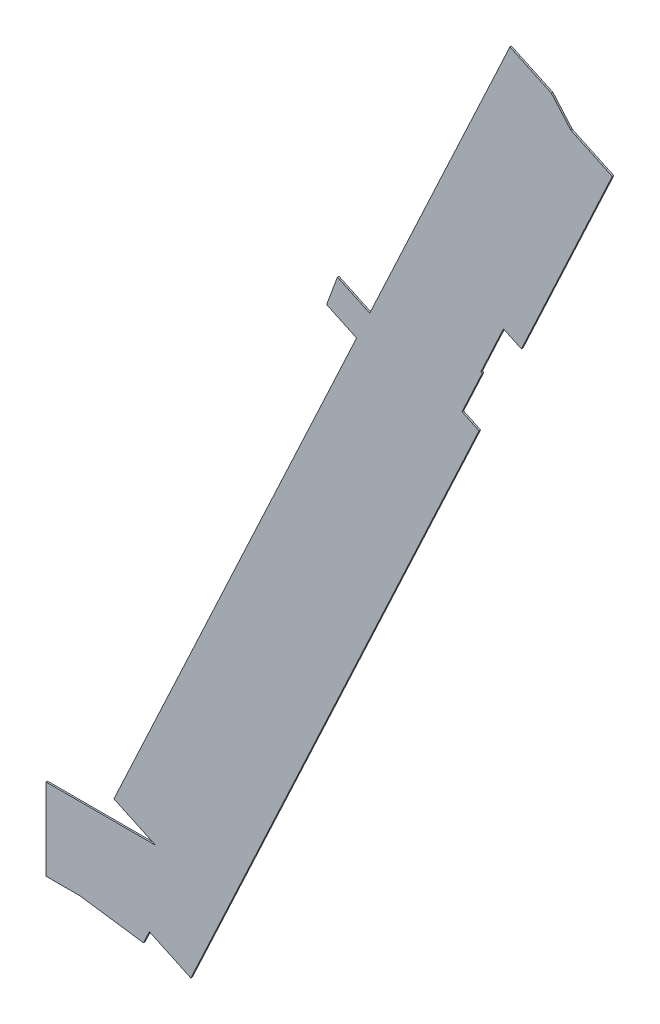
ISO-10303-21;
HEADER;
FILE_DESCRIPTION(('STEP AP214'),'2;1');
FILE_NAME('part.step','',(''),(''),'','','');
FILE_SCHEMA(('AUTOMOTIVE_DESIGN { 1 0 10303 214 1 1 1 1 }'));
ENDSEC;
DATA;
#1=APPLICATION_CONTEXT('core data for automotive mechanical design processes');
#2=APPLICATION_PROTOCOL_DEFINITION('international standard','automotive_design',2000,#1);
#3=PRODUCT_CONTEXT('',#1,'mechanical');
#4=PRODUCT('Part','Part','',(#3));
#5=PRODUCT_RELATED_PRODUCT_CATEGORY('part','',(#4));
#6=PRODUCT_DEFINITION_FORMATION('','',#4);
#7=PRODUCT_DEFINITION_CONTEXT('part definition',#1,'design');
#8=PRODUCT_DEFINITION('design','',#6,#7);
#9=PRODUCT_DEFINITION_SHAPE('','',#8);
#10=(LENGTH_UNIT() NAMED_UNIT(*) SI_UNIT(.MILLI.,.METRE.));
#11=(NAMED_UNIT(*) PLANE_ANGLE_UNIT() SI_UNIT($,.RADIAN.));
#12=(NAMED_UNIT(*) SI_UNIT($,.STERADIAN.) SOLID_ANGLE_UNIT());
#13=UNCERTAINTY_MEASURE_WITH_UNIT(LENGTH_MEASURE(1.E-05),#10,'distance_accuracy_value','');
#14=(GEOMETRIC_REPRESENTATION_CONTEXT(3) GLOBAL_UNCERTAINTY_ASSIGNED_CONTEXT((#13)) GLOBAL_UNIT_ASSIGNED_CONTEXT((#10,
#11,#12)) REPRESENTATION_CONTEXT('',''));
#15=CARTESIAN_POINT('',(0.,0.,0.));
#16=DIRECTION('',(0.,0.,1.));
#17=DIRECTION('',(1.,0.,0.));
#18=AXIS2_PLACEMENT_3D('',#15,#16,#17);
#19=CARTESIAN_POINT('',(-250.049303620003,-536.232462082202,48.5));
#20=DIRECTION('',(-0.42261826174037,-0.906307787036804,0.));
#21=DIRECTION('',(0.906307787036804,-0.42261826174037,0.));
#22=AXIS2_PLACEMENT_3D('',#19,#20,#21);
#23=PLANE('',#22);
#24=DIRECTION('',(0.906307787036804,-0.42261826174037,0.));
#25=VECTOR('',#24,1.);
#26=CARTESIAN_POINT('',(-250.049303620003,-536.232462082202,49.5));
#27=LINE('',#26,#25);
#28=CARTESIAN_POINT('',(1113.84582618202,-1172.22720602859,49.5));
#29=VERTEX_POINT('',#28);
#30=CARTESIAN_POINT('',(1141.03505979313,-1184.9057538808,49.5));
#31=VERTEX_POINT('',#30);
#32=EDGE_CURVE('E211',#29,#31,#27,.T.);
#33=ORIENTED_EDGE('',*,*,#32,.F.);
#34=DIRECTION('',(0.,0.,1.));
#35=VECTOR('',#34,1.);
#36=CARTESIAN_POINT('',(1113.84582618202,-1172.22720602859,48.5));
#37=LINE('',#36,#35);
#38=CARTESIAN_POINT('',(1113.84582618202,-1172.22720602859,48.5));
#39=VERTEX_POINT('',#38);
#40=EDGE_CURVE('E11',#39,#29,#37,.T.);
#41=ORIENTED_EDGE('',*,*,#40,.F.);
#42=DIRECTION('',(0.906307787036804,-0.42261826174037,0.));
#43=VECTOR('',#42,1.);
#44=CARTESIAN_POINT('',(-250.049303620003,-536.232462082202,48.5));
#45=LINE('',#44,#43);
#46=CARTESIAN_POINT('',(1141.03505979313,-1184.9057538808,48.5));
#47=VERTEX_POINT('',#46);
#48=EDGE_CURVE('E271',#39,#47,#45,.T.);
#49=ORIENTED_EDGE('',*,*,#48,.T.);
#50=DIRECTION('',(0.,0.,1.));
#51=VECTOR('',#50,1.);
#52=CARTESIAN_POINT('',(1141.03505979313,-1184.9057538808,48.5));
#53=LINE('',#52,#51);
#54=EDGE_CURVE('E38',#47,#31,#53,.T.);
#55=ORIENTED_EDGE('',*,*,#54,.T.);
#56=EDGE_LOOP('',(#33,#41,#49,#55));
#57=FACE_BOUND('',#56,.T.);
#58=ADVANCED_FACE('F35',(#57),#23,.T.);
#59=CARTESIAN_POINT('',(1363.89512980202,-635.994743946451,48.5));
#60=DIRECTION('',(0.906307787036787,-0.422618261740406,0.));
#61=DIRECTION('',(0.422618261740406,0.906307787036787,0.));
#62=AXIS2_PLACEMENT_3D('',#59,#60,#61);
#63=PLANE('',#62);
#64=DIRECTION('',(0.422618261740406,0.906307787036787,0.));
#65=VECTOR('',#64,1.);
#66=CARTESIAN_POINT('',(1363.89512980202,-635.994743946451,49.5));
#67=LINE('',#66,#65);
#68=CARTESIAN_POINT('',(1110.00000000019,-1180.47460689062,49.5));
#69=VERTEX_POINT('',#68);
#70=EDGE_CURVE('E269',#69,#29,#67,.T.);
#71=ORIENTED_EDGE('',*,*,#70,.F.);
#72=DIRECTION('',(0.,0.,1.));
#73=VECTOR('',#72,1.);
#74=CARTESIAN_POINT('',(1110.00000000019,-1180.47460689062,48.5));
#75=LINE('',#74,#73);
#76=CARTESIAN_POINT('',(1110.00000000019,-1180.47460689062,48.5));
#77=VERTEX_POINT('',#76);
#78=EDGE_CURVE('E44',#77,#69,#75,.T.);
#79=ORIENTED_EDGE('',*,*,#78,.F.);
#80=DIRECTION('',(0.422618261740406,0.906307787036787,0.));
#81=VECTOR('',#80,1.);
#82=CARTESIAN_POINT('',(1363.89512980202,-635.994743946451,48.5));
#83=LINE('',#82,#81);
#84=EDGE_CURVE('E201',#77,#39,#83,.T.);
#85=ORIENTED_EDGE('',*,*,#84,.T.);
#86=ORIENTED_EDGE('',*,*,#40,.T.);
#87=EDGE_LOOP('',(#71,#79,#85,#86));
#88=FACE_BOUND('',#87,.T.);
#89=ADVANCED_FACE('F313',(#88),#63,.T.);
#90=CARTESIAN_POINT('',(-141.191690871491,-1004.63108228358,48.5));
#91=DIRECTION('',(-0.139173100959475,-0.990268068741653,0.));
#92=DIRECTION('',(0.990268068741653,-0.139173100959475,0.));
#93=AXIS2_PLACEMENT_3D('',#90,#91,#92);
#94=PLANE('',#93);
#95=DIRECTION('',(0.990268068741653,-0.139173100959475,0.));
#96=VECTOR('',#95,1.);
#97=CARTESIAN_POINT('',(-141.191690871491,-1004.63108228358,49.5));
#98=LINE('',#97,#96);
#99=CARTESIAN_POINT('',(1068.20000000018,-1174.60000000009,49.5));
#100=VERTEX_POINT('',#99);
#101=EDGE_CURVE('E187',#100,#69,#98,.T.);
#102=ORIENTED_EDGE('',*,*,#101,.F.);
#103=DIRECTION('',(0.,0.,1.));
#104=VECTOR('',#103,1.);
#105=CARTESIAN_POINT('',(1068.20000000018,-1174.60000000009,48.5));
#106=LINE('',#105,#104);
#107=CARTESIAN_POINT('',(1068.20000000018,-1174.60000000009,48.5));
#108=VERTEX_POINT('',#107);
#109=EDGE_CURVE('E182',#108,#100,#106,.T.);
#110=ORIENTED_EDGE('',*,*,#109,.F.);
#111=DIRECTION('',(0.990268068741653,-0.139173100959475,0.));
#112=VECTOR('',#111,1.);
#113=CARTESIAN_POINT('',(-141.191690871491,-1004.63108228358,48.5));
#114=LINE('',#113,#112);
#115=EDGE_CURVE('E185',#108,#77,#114,.T.);
#116=ORIENTED_EDGE('',*,*,#115,.T.);
#117=ORIENTED_EDGE('',*,*,#78,.T.);
#118=EDGE_LOOP('',(#102,#110,#116,#117));
#119=FACE_BOUND('',#118,.T.);
#120=ADVANCED_FACE('F184',(#119),#94,.T.);
#121=CARTESIAN_POINT('',(4.38641042680267E-10,-1174.60000000049,48.5));
#122=DIRECTION('',(3.73438653737515E-13,-1.,0.));
#123=DIRECTION('',(1.,3.73438653737515E-13,0.));
#124=AXIS2_PLACEMENT_3D('',#121,#122,#123);
#125=PLANE('',#124);
#126=DIRECTION('',(1.,3.73438653737515E-13,0.));
#127=VECTOR('',#126,1.);
#128=CARTESIAN_POINT('',(4.38641042680267E-10,-1174.60000000049,49.5));
#129=LINE('',#128,#127);
#130=CARTESIAN_POINT('',(1046.20000000018,-1174.6000000001,49.5));
#131=VERTEX_POINT('',#130);
#132=EDGE_CURVE('E266',#131,#100,#129,.T.);
#133=ORIENTED_EDGE('',*,*,#132,.F.);
#134=DIRECTION('',(0.,0.,1.));
#135=VECTOR('',#134,1.);
#136=CARTESIAN_POINT('',(1046.20000000018,-1174.6000000001,48.5));
#137=LINE('',#136,#135);
#138=CARTESIAN_POINT('',(1046.20000000018,-1174.6000000001,48.5));
#139=VERTEX_POINT('',#138);
#140=EDGE_CURVE('E192',#139,#131,#137,.T.);
#141=ORIENTED_EDGE('',*,*,#140,.F.);
#142=DIRECTION('',(1.,3.73438653737515E-13,0.));
#143=VECTOR('',#142,1.);
#144=CARTESIAN_POINT('',(4.38641042680267E-10,-1174.60000000049,48.5));
#145=LINE('',#144,#143);
#146=EDGE_CURVE('E199',#139,#108,#145,.T.);
#147=ORIENTED_EDGE('',*,*,#146,.T.);
#148=ORIENTED_EDGE('',*,*,#109,.T.);
#149=EDGE_LOOP('',(#133,#141,#147,#148));
#150=FACE_BOUND('',#149,.T.);
#151=ADVANCED_FACE('F203',(#150),#125,.T.);
#152=CARTESIAN_POINT('',(1046.19999999975,3.86448090557967E-10,48.5));
#153=DIRECTION('',(-1.,-3.69382613800479E-13,0.));
#154=DIRECTION('',(3.69382613800479E-13,-1.,0.));
#155=AXIS2_PLACEMENT_3D('',#152,#153,#154);
#156=PLANE('',#155);
#157=DIRECTION('',(3.69382613800479E-13,-1.,0.));
#158=VECTOR('',#157,1.);
#159=CARTESIAN_POINT('',(1046.19999999975,3.86448090557967E-10,49.5));
#160=LINE('',#159,#158);
#161=CARTESIAN_POINT('',(1046.20000000016,-1121.10000000009,49.5));
#162=VERTEX_POINT('',#161);
#163=EDGE_CURVE('E263',#162,#131,#160,.T.);
#164=ORIENTED_EDGE('',*,*,#163,.F.);
#165=DIRECTION('',(0.,0.,1.));
#166=VECTOR('',#165,1.);
#167=CARTESIAN_POINT('',(1046.20000000016,-1121.10000000009,48.5));
#168=LINE('',#167,#166);
#169=CARTESIAN_POINT('',(1046.20000000016,-1121.10000000009,48.5));
#170=VERTEX_POINT('',#169);
#171=EDGE_CURVE('E275',#170,#162,#168,.T.);
#172=ORIENTED_EDGE('',*,*,#171,.F.);
#173=DIRECTION('',(3.69382613800479E-13,-1.,0.));
#174=VECTOR('',#173,1.);
#175=CARTESIAN_POINT('',(1046.19999999975,3.86448090557967E-10,48.5));
#176=LINE('',#175,#174);
#177=EDGE_CURVE('E204',#170,#139,#176,.T.);
#178=ORIENTED_EDGE('',*,*,#177,.T.);
#179=ORIENTED_EDGE('',*,*,#140,.T.);
#180=EDGE_LOOP('',(#164,#172,#178,#179));
#181=FACE_BOUND('',#180,.T.);
#182=ADVANCED_FACE('F326',(#181),#156,.T.);
#183=CARTESIAN_POINT('',(3.36261932278332E-09,-1121.10000000322,48.5));
#184=DIRECTION('',(-2.9993928487857E-12,1.,0.));
#185=DIRECTION('',(-1.,-2.9993928487857E-12,0.));
#186=AXIS2_PLACEMENT_3D('',#183,#184,#185);
#187=PLANE('',#186);
#188=DIRECTION('',(-1.,-2.9993928487857E-12,0.));
#189=VECTOR('',#188,1.);
#190=CARTESIAN_POINT('',(3.36261932278332E-09,-1121.10000000322,49.5));
#191=LINE('',#190,#189);
#192=CARTESIAN_POINT('',(1117.80000000016,-1121.09999999987,49.5));
#193=VERTEX_POINT('',#192);
#194=EDGE_CURVE('E260',#193,#162,#191,.T.);
#195=ORIENTED_EDGE('',*,*,#194,.F.);
#196=DIRECTION('',(0.,0.,1.));
#197=VECTOR('',#196,1.);
#198=CARTESIAN_POINT('',(1117.80000000016,-1121.09999999987,48.5));
#199=LINE('',#198,#197);
#200=CARTESIAN_POINT('',(1117.80000000016,-1121.09999999987,48.5));
#201=VERTEX_POINT('',#200);
#202=EDGE_CURVE('E277',#201,#193,#199,.T.);
#203=ORIENTED_EDGE('',*,*,#202,.F.);
#204=DIRECTION('',(-1.,-2.9993928487857E-12,0.));
#205=VECTOR('',#204,1.);
#206=CARTESIAN_POINT('',(3.36261932278332E-09,-1121.10000000322,48.5));
#207=LINE('',#206,#205);
#208=EDGE_CURVE('E206',#201,#170,#207,.T.);
#209=ORIENTED_EDGE('',*,*,#208,.T.);
#210=ORIENTED_EDGE('',*,*,#171,.T.);
#211=EDGE_LOOP('',(#195,#203,#209,#210));
#212=FACE_BOUND('',#211,.T.);
#213=ADVANCED_FACE('F329',(#212),#187,.T.);
#214=CARTESIAN_POINT('',(-229.760207644477,-492.722355355133,48.5));
#215=DIRECTION('',(-0.422618261737995,-0.906307787037911,0.));
#216=DIRECTION('',(0.906307787037911,-0.422618261737995,0.));
#217=AXIS2_PLACEMENT_3D('',#214,#215,#216);
#218=PLANE('',#217);
#219=DIRECTION('',(0.906307787037911,-0.422618261737995,0.));
#220=VECTOR('',#219,1.);
#221=CARTESIAN_POINT('',(-229.760207644477,-492.722355355133,49.5));
#222=LINE('',#221,#220);
#223=CARTESIAN_POINT('',(1090.61076638903,-1108.42145214773,49.5));
#224=VERTEX_POINT('',#223);
#225=EDGE_CURVE('E257',#224,#193,#222,.T.);
#226=ORIENTED_EDGE('',*,*,#225,.F.);
#227=DIRECTION('',(0.,0.,1.));
#228=VECTOR('',#227,1.);
#229=CARTESIAN_POINT('',(1090.61076638903,-1108.42145214773,48.5));
#230=LINE('',#229,#228);
#231=CARTESIAN_POINT('',(1090.61076638903,-1108.42145214773,48.5));
#232=VERTEX_POINT('',#231);
#233=EDGE_CURVE('E279',#232,#224,#230,.T.);
#234=ORIENTED_EDGE('',*,*,#233,.F.);
#235=DIRECTION('',(0.906307787037911,-0.422618261737995,0.));
#236=VECTOR('',#235,1.);
#237=CARTESIAN_POINT('',(-229.760207644477,-492.722355355133,48.5));
#238=LINE('',#237,#236);
#239=EDGE_CURVE('E422',#232,#201,#238,.T.);
#240=ORIENTED_EDGE('',*,*,#239,.T.);
#241=ORIENTED_EDGE('',*,*,#202,.T.);
#242=EDGE_LOOP('',(#226,#234,#240,#241));
#243=FACE_BOUND('',#242,.T.);
#244=ADVANCED_FACE('F333',(#243),#218,.T.);
#245=CARTESIAN_POINT('',(1320.37097403331,-615.699096796678,48.5));
#246=DIRECTION('',(-0.906307787036815,0.422618261740345,0.));
#247=DIRECTION('',(-0.422618261740345,-0.906307787036815,0.));
#248=AXIS2_PLACEMENT_3D('',#245,#246,#247);
#249=PLANE('',#248);
#250=DIRECTION('',(-0.422618261740345,-0.906307787036815,0.));
#251=VECTOR('',#250,1.);
#252=CARTESIAN_POINT('',(1320.37097403331,-615.699096796678,49.5));
#253=LINE('',#252,#251);
#254=CARTESIAN_POINT('',(1249.68428010822,-767.287201107135,49.5));
#255=VERTEX_POINT('',#254);
#256=EDGE_CURVE('E254',#255,#224,#253,.T.);
#257=ORIENTED_EDGE('',*,*,#256,.F.);
#258=DIRECTION('',(0.,0.,1.));
#259=VECTOR('',#258,1.);
#260=CARTESIAN_POINT('',(1249.68428010822,-767.287201107135,48.5));
#261=LINE('',#260,#259);
#262=CARTESIAN_POINT('',(1249.68428010822,-767.287201107135,48.5));
#263=VERTEX_POINT('',#262);
#264=EDGE_CURVE('E281',#263,#255,#261,.T.);
#265=ORIENTED_EDGE('',*,*,#264,.F.);
#266=DIRECTION('',(-0.422618261740345,-0.906307787036815,0.));
#267=VECTOR('',#266,1.);
#268=CARTESIAN_POINT('',(1320.37097403331,-615.699096796678,48.5));
#269=LINE('',#268,#267);
#270=EDGE_CURVE('E426',#263,#232,#269,.T.);
#271=ORIENTED_EDGE('',*,*,#270,.T.);
#272=ORIENTED_EDGE('',*,*,#233,.T.);
#273=EDGE_LOOP('',(#257,#265,#271,#272));
#274=FACE_BOUND('',#273,.T.);
#275=ADVANCED_FACE('F337',(#274),#249,.T.);
#276=CARTESIAN_POINT('',(-70.6866939251331,-151.588104310579,48.5));
#277=DIRECTION('',(-0.422618261740265,-0.906307787036853,0.));
#278=DIRECTION('',(0.906307787036853,-0.422618261740265,0.));
#279=AXIS2_PLACEMENT_3D('',#276,#277,#278);
#280=PLANE('',#279);
#281=DIRECTION('',(0.906307787036853,-0.422618261740265,0.));
#282=VECTOR('',#281,1.);
#283=CARTESIAN_POINT('',(-70.6866939251331,-151.588104310579,49.5));
#284=LINE('',#283,#282);
#285=CARTESIAN_POINT('',(1230.03918127819,-758.126541077492,49.5));
#286=VERTEX_POINT('',#285);
#287=EDGE_CURVE('E251',#286,#255,#284,.T.);
#288=ORIENTED_EDGE('',*,*,#287,.F.);
#289=DIRECTION('',(0.,0.,1.));
#290=VECTOR('',#289,1.);
#291=CARTESIAN_POINT('',(1230.03918127819,-758.126541077492,48.5));
#292=LINE('',#291,#290);
#293=CARTESIAN_POINT('',(1230.03918127808,-758.126541077531,48.5));
#294=VERTEX_POINT('',#293);
#295=EDGE_CURVE('E283',#294,#286,#292,.T.);
#296=ORIENTED_EDGE('',*,*,#295,.F.);
#297=DIRECTION('',(0.906307787036853,-0.422618261740265,0.));
#298=VECTOR('',#297,1.);
#299=CARTESIAN_POINT('',(-70.6866939251331,-151.588104310579,48.5));
#300=LINE('',#299,#298);
#301=EDGE_CURVE('E415',#294,#263,#300,.T.);
#302=ORIENTED_EDGE('',*,*,#301,.T.);
#303=ORIENTED_EDGE('',*,*,#264,.T.);
#304=EDGE_LOOP('',(#288,#296,#302,#303));
#305=FACE_BOUND('',#304,.T.);
#306=ADVANCED_FACE('F341',(#305),#280,.T.);
#307=CARTESIAN_POINT('',(-62.1021741391018,-133.178542220138,48.5));
#308=DIRECTION('',(0.422618261740323,0.906307787036826,0.));
#309=DIRECTION('',(-0.906307787036826,0.422618261740323,0.));
#310=AXIS2_PLACEMENT_3D('',#307,#308,#309);
#311=PLANE('',#310);
#312=DIRECTION('',(-0.906307787036826,0.422618261740323,0.));
#313=VECTOR('',#312,1.);
#314=CARTESIAN_POINT('',(-62.1021741391018,-133.178542220138,49.5));
#315=LINE('',#314,#313);
#316=CARTESIAN_POINT('',(1258.26879989402,-748.87763901669,49.5));
#317=VERTEX_POINT('',#316);
#318=CARTESIAN_POINT('',(1237.0998400448,-739.006390923825,49.5));
#319=VERTEX_POINT('',#318);
#320=EDGE_CURVE('E248',#317,#319,#315,.T.);
#321=ORIENTED_EDGE('',*,*,#320,.F.);
#322=DIRECTION('',(0.,0.,1.));
#323=VECTOR('',#322,1.);
#324=CARTESIAN_POINT('',(1258.26879989402,-748.87763901669,48.5));
#325=LINE('',#324,#323);
#326=CARTESIAN_POINT('',(1258.26879989402,-748.87763901669,48.5));
#327=VERTEX_POINT('',#326);
#328=EDGE_CURVE('E288',#327,#317,#325,.T.);
#329=ORIENTED_EDGE('',*,*,#328,.F.);
#330=DIRECTION('',(-0.906307787036826,0.422618261740323,0.));
#331=VECTOR('',#330,1.);
#332=CARTESIAN_POINT('',(-62.1021741391018,-133.178542220138,48.5));
#333=LINE('',#332,#331);
#334=CARTESIAN_POINT('',(1237.0998400448,-739.006390923825,48.5));
#335=VERTEX_POINT('',#334);
#336=EDGE_CURVE('E431',#327,#335,#333,.T.);
#337=ORIENTED_EDGE('',*,*,#336,.T.);
#338=DIRECTION('',(0.,0.,1.));
#339=VECTOR('',#338,1.);
#340=CARTESIAN_POINT('',(1237.09984004467,-739.006390923773,48.5));
#341=LINE('',#340,#339);
#342=EDGE_CURVE('E285',#335,#319,#341,.T.);
#343=ORIENTED_EDGE('',*,*,#342,.T.);
#344=EDGE_LOOP('',(#321,#329,#337,#343));
#345=FACE_BOUND('',#344,.T.);
#346=ADVANCED_FACE('F345',(#345),#311,.T.);
#347=CARTESIAN_POINT('',(1320.37097403309,-615.699096796623,48.5));
#348=DIRECTION('',(-0.906307787036803,0.42261826174037,0.));
#349=DIRECTION('',(-0.42261826174037,-0.906307787036803,0.));
#350=AXIS2_PLACEMENT_3D('',#347,#348,#349);
#351=PLANE('',#350);
#352=DIRECTION('',(-0.42261826174037,-0.906307787036803,0.));
#353=VECTOR('',#352,1.);
#354=CARTESIAN_POINT('',(1320.37097403309,-615.699096796623,49.5));
#355=LINE('',#354,#353);
#356=CARTESIAN_POINT('',(1350.18827182255,-551.755695336188,49.5));
#357=VERTEX_POINT('',#356);
#358=EDGE_CURVE('E245',#357,#317,#355,.T.);
#359=ORIENTED_EDGE('',*,*,#358,.F.);
#360=DIRECTION('',(0.,0.,1.));
#361=VECTOR('',#360,1.);
#362=CARTESIAN_POINT('',(1350.18827182255,-551.755695336188,48.5));
#363=LINE('',#362,#361);
#364=CARTESIAN_POINT('',(1350.18827182255,-551.755695336188,48.5));
#365=VERTEX_POINT('',#364);
#366=EDGE_CURVE('E290',#365,#357,#363,.T.);
#367=ORIENTED_EDGE('',*,*,#366,.F.);
#368=DIRECTION('',(-0.42261826174037,-0.906307787036803,0.));
#369=VECTOR('',#368,1.);
#370=CARTESIAN_POINT('',(1320.37097403309,-615.699096796623,48.5));
#371=LINE('',#370,#369);
#372=EDGE_CURVE('E434',#365,#327,#371,.T.);
#373=ORIENTED_EDGE('',*,*,#372,.T.);
#374=ORIENTED_EDGE('',*,*,#328,.T.);
#375=EDGE_LOOP('',(#359,#367,#373,#374));
#376=FACE_BOUND('',#375,.T.);
#377=ADVANCED_FACE('F349',(#376),#351,.T.);
#378=CARTESIAN_POINT('',(29.8172977894515,63.9434014604338,48.5));
#379=DIRECTION('',(0.422618261740369,0.906307787036804,0.));
#380=DIRECTION('',(-0.906307787036804,0.422618261740369,0.));
#381=AXIS2_PLACEMENT_3D('',#378,#379,#380);
#382=PLANE('',#381);
#383=DIRECTION('',(-0.906307787036804,0.422618261740369,0.));
#384=VECTOR('',#383,1.);
#385=CARTESIAN_POINT('',(29.8172977894515,63.9434014604338,49.5));
#386=LINE('',#385,#384);
#387=CARTESIAN_POINT('',(1377.3775054338,-564.434243188469,49.5));
#388=VERTEX_POINT('',#387);
#389=EDGE_CURVE('E242',#388,#357,#386,.T.);
#390=ORIENTED_EDGE('',*,*,#389,.F.);
#391=DIRECTION('',(0.,0.,1.));
#392=VECTOR('',#391,1.);
#393=CARTESIAN_POINT('',(1377.3775054338,-564.434243188469,48.5));
#394=LINE('',#393,#392);
#395=CARTESIAN_POINT('',(1377.3775054338,-564.434243188469,48.5));
#396=VERTEX_POINT('',#395);
#397=EDGE_CURVE('E292',#396,#388,#394,.T.);
#398=ORIENTED_EDGE('',*,*,#397,.F.);
#399=DIRECTION('',(-0.906307787036804,0.422618261740369,0.));
#400=VECTOR('',#399,1.);
#401=CARTESIAN_POINT('',(29.8172977894515,63.9434014604338,48.5));
#402=LINE('',#401,#400);
#403=EDGE_CURVE('E437',#396,#365,#402,.T.);
#404=ORIENTED_EDGE('',*,*,#403,.T.);
#405=ORIENTED_EDGE('',*,*,#366,.T.);
#406=EDGE_LOOP('',(#390,#398,#404,#405));
#407=FACE_BOUND('',#406,.T.);
#408=ADVANCED_FACE('F353',(#407),#382,.T.);
#409=CARTESIAN_POINT('',(505.065098072596,439.046391481787,48.5));
#410=DIRECTION('',(0.754709580227635,0.656059028984913,0.));
#411=DIRECTION('',(-0.656059028984913,0.754709580227635,0.));
#412=AXIS2_PLACEMENT_3D('',#409,#410,#411);
#413=PLANE('',#412);
#414=DIRECTION('',(-0.656059028984913,0.754709580227635,0.));
#415=VECTOR('',#414,1.);
#416=CARTESIAN_POINT('',(505.065098072596,439.046391481787,49.5));
#417=LINE('',#416,#415);
#418=CARTESIAN_POINT('',(1390.10505059611,-579.075609044889,49.5));
#419=VERTEX_POINT('',#418);
#420=EDGE_CURVE('E239',#419,#388,#417,.T.);
#421=ORIENTED_EDGE('',*,*,#420,.F.);
#422=DIRECTION('',(0.,0.,1.));
#423=VECTOR('',#422,1.);
#424=CARTESIAN_POINT('',(1390.10505059611,-579.075609044889,48.5));
#425=LINE('',#424,#423);
#426=CARTESIAN_POINT('',(1390.10505059611,-579.075609044889,48.5));
#427=VERTEX_POINT('',#426);
#428=EDGE_CURVE('E294',#427,#419,#425,.T.);
#429=ORIENTED_EDGE('',*,*,#428,.F.);
#430=DIRECTION('',(-0.656059028984913,0.754709580227635,0.));
#431=VECTOR('',#430,1.);
#432=CARTESIAN_POINT('',(505.065098072596,439.046391481787,48.5));
#433=LINE('',#432,#431);
#434=EDGE_CURVE('E440',#427,#396,#433,.T.);
#435=ORIENTED_EDGE('',*,*,#434,.T.);
#436=ORIENTED_EDGE('',*,*,#397,.T.);
#437=EDGE_LOOP('',(#421,#429,#435,#436));
#438=FACE_BOUND('',#437,.T.);
#439=ADVANCED_FACE('F357',(#438),#413,.T.);
#440=CARTESIAN_POINT('',(26.4825477241958,56.7920068680423,48.5));
#441=DIRECTION('',(0.422618261735934,0.906307787038872,0.));
#442=DIRECTION('',(-0.906307787038872,0.422618261735934,0.));
#443=AXIS2_PLACEMENT_3D('',#440,#441,#442);
#444=PLANE('',#443);
#445=DIRECTION('',(-0.906307787038872,0.422618261735934,0.));
#446=VECTOR('',#445,1.);
#447=CARTESIAN_POINT('',(26.4825477241958,56.7920068680423,49.5));
#448=LINE('',#447,#446);
#449=CARTESIAN_POINT('',(1417.29428420728,-591.754156896966,49.5));
#450=VERTEX_POINT('',#449);
#451=EDGE_CURVE('E236',#450,#419,#448,.T.);
#452=ORIENTED_EDGE('',*,*,#451,.F.);
#453=DIRECTION('',(0.,0.,1.));
#454=VECTOR('',#453,1.);
#455=CARTESIAN_POINT('',(1417.29428420728,-591.754156896966,48.5));
#456=LINE('',#455,#454);
#457=CARTESIAN_POINT('',(1417.29428420728,-591.754156896966,48.5));
#458=VERTEX_POINT('',#457);
#459=EDGE_CURVE('E296',#458,#450,#456,.T.);
#460=ORIENTED_EDGE('',*,*,#459,.F.);
#461=DIRECTION('',(-0.906307787038872,0.422618261735934,0.));
#462=VECTOR('',#461,1.);
#463=CARTESIAN_POINT('',(26.4825477241958,56.7920068680423,48.5));
#464=LINE('',#463,#462);
#465=EDGE_CURVE('E443',#458,#427,#464,.T.);
#466=ORIENTED_EDGE('',*,*,#465,.T.);
#467=ORIENTED_EDGE('',*,*,#428,.T.);
#468=EDGE_LOOP('',(#452,#460,#466,#467));
#469=FACE_BOUND('',#468,.T.);
#470=ADVANCED_FACE('F361',(#469),#444,.T.);
#471=CARTESIAN_POINT('',(1390.81173647964,-648.546163771691,48.5));
#472=DIRECTION('',(0.906307787036804,-0.422618261740369,0.));
#473=DIRECTION('',(0.422618261740369,0.906307787036804,0.));
#474=AXIS2_PLACEMENT_3D('',#471,#472,#473);
#475=PLANE('',#474);
#476=DIRECTION('',(0.422618261740369,0.906307787036804,0.));
#477=VECTOR('',#476,1.);
#478=CARTESIAN_POINT('',(1390.81173647964,-648.546163771691,49.5));
#479=LINE('',#478,#477);
#480=CARTESIAN_POINT('',(1357.74737112807,-719.452924090455,49.5));
#481=VERTEX_POINT('',#480);
#482=EDGE_CURVE('E233',#481,#450,#479,.T.);
#483=ORIENTED_EDGE('',*,*,#482,.F.);
#484=DIRECTION('',(0.,0.,1.));
#485=VECTOR('',#484,1.);
#486=CARTESIAN_POINT('',(1357.74737112807,-719.452924090455,48.5));
#487=LINE('',#486,#485);
#488=CARTESIAN_POINT('',(1357.74737112807,-719.452924090455,48.5));
#489=VERTEX_POINT('',#488);
#490=EDGE_CURVE('E298',#489,#481,#487,.T.);
#491=ORIENTED_EDGE('',*,*,#490,.F.);
#492=DIRECTION('',(0.422618261740369,0.906307787036804,0.));
#493=VECTOR('',#492,1.);
#494=CARTESIAN_POINT('',(1390.81173647964,-648.546163771691,48.5));
#495=LINE('',#494,#493);
#496=EDGE_CURVE('E446',#489,#458,#495,.T.);
#497=ORIENTED_EDGE('',*,*,#496,.T.);
#498=ORIENTED_EDGE('',*,*,#459,.T.);
#499=EDGE_LOOP('',(#483,#491,#497,#498));
#500=FACE_BOUND('',#499,.T.);
#501=ADVANCED_FACE('F365',(#500),#475,.T.);
#502=CARTESIAN_POINT('',(-33.0643653515879,-70.90676031881,48.5));
#503=DIRECTION('',(-0.422618261740341,-0.906307787036817,0.));
#504=DIRECTION('',(0.906307787036817,-0.422618261740341,0.));
#505=AXIS2_PLACEMENT_3D('',#502,#503,#504);
#506=PLANE('',#505);
#507=DIRECTION('',(0.906307787036817,-0.422618261740341,0.));
#508=VECTOR('',#507,1.);
#509=CARTESIAN_POINT('',(-33.0643653515879,-70.90676031881,49.5));
#510=LINE('',#509,#508);
#511=CARTESIAN_POINT('',(1345.96536989662,-713.958886687846,49.5));
#512=VERTEX_POINT('',#511);
#513=EDGE_CURVE('E230',#512,#481,#510,.T.);
#514=ORIENTED_EDGE('',*,*,#513,.F.);
#515=DIRECTION('',(0.,0.,1.));
#516=VECTOR('',#515,1.);
#517=CARTESIAN_POINT('',(1345.96536989662,-713.958886687846,48.5));
#518=LINE('',#517,#516);
#519=CARTESIAN_POINT('',(1345.96536989662,-713.958886687846,48.5));
#520=VERTEX_POINT('',#519);
#521=EDGE_CURVE('E300',#520,#512,#518,.T.);
#522=ORIENTED_EDGE('',*,*,#521,.F.);
#523=DIRECTION('',(0.906307787036817,-0.422618261740341,0.));
#524=VECTOR('',#523,1.);
#525=CARTESIAN_POINT('',(-33.0643653515879,-70.90676031881,48.5));
#526=LINE('',#525,#524);
#527=EDGE_CURVE('E449',#520,#489,#526,.T.);
#528=ORIENTED_EDGE('',*,*,#527,.T.);
#529=ORIENTED_EDGE('',*,*,#490,.T.);
#530=EDGE_LOOP('',(#514,#522,#528,#529));
#531=FACE_BOUND('',#530,.T.);
#532=ADVANCED_FACE('F369',(#531),#506,.T.);
#533=CARTESIAN_POINT('',(1379.02973524824,-643.052126368955,48.5));
#534=DIRECTION('',(0.906307787036842,-0.422618261740288,0.));
#535=DIRECTION('',(0.422618261740288,0.906307787036842,0.));
#536=AXIS2_PLACEMENT_3D('',#533,#534,#535);
#537=PLANE('',#536);
#538=DIRECTION('',(0.422618261740288,0.906307787036842,0.));
#539=VECTOR('',#538,1.);
#540=CARTESIAN_POINT('',(1379.02973524824,-643.052126368955,49.5));
#541=LINE('',#540,#539);
#542=CARTESIAN_POINT('',(1331.17373073571,-745.679659234136,49.5));
#543=VERTEX_POINT('',#542);
#544=EDGE_CURVE('E227',#543,#512,#541,.T.);
#545=ORIENTED_EDGE('',*,*,#544,.F.);
#546=DIRECTION('',(0.,0.,1.));
#547=VECTOR('',#546,1.);
#548=CARTESIAN_POINT('',(1331.17373073571,-745.679659234136,48.5));
#549=LINE('',#548,#547);
#550=CARTESIAN_POINT('',(1331.17373073571,-745.679659234136,48.5));
#551=VERTEX_POINT('',#550);
#552=EDGE_CURVE('E302',#551,#543,#549,.T.);
#553=ORIENTED_EDGE('',*,*,#552,.F.);
#554=DIRECTION('',(0.422618261740288,0.906307787036842,0.));
#555=VECTOR('',#554,1.);
#556=CARTESIAN_POINT('',(1379.02973524824,-643.052126368955,48.5));
#557=LINE('',#556,#555);
#558=EDGE_CURVE('E452',#551,#520,#557,.T.);
#559=ORIENTED_EDGE('',*,*,#558,.T.);
#560=ORIENTED_EDGE('',*,*,#521,.T.);
#561=EDGE_LOOP('',(#545,#553,#559,#560));
#562=FACE_BOUND('',#561,.T.);
#563=ADVANCED_FACE('F373',(#562),#537,.T.);
#564=CARTESIAN_POINT('',(-47.8560045125169,-102.627532865143,48.5));
#565=DIRECTION('',(0.422618261740312,0.90630778703683,0.));
#566=DIRECTION('',(-0.90630778703683,0.422618261740312,0.));
#567=AXIS2_PLACEMENT_3D('',#564,#565,#566);
#568=PLANE('',#567);
#569=DIRECTION('',(-0.906307787036831,0.422618261740312,0.));
#570=VECTOR('',#569,1.);
#571=CARTESIAN_POINT('',(-47.8560045125169,-102.627532865143,49.5));
#572=LINE('',#571,#570);
#573=CARTESIAN_POINT('',(1332.0800385228,-746.1022774959,49.5));
#574=VERTEX_POINT('',#573);
#575=EDGE_CURVE('E224',#574,#543,#572,.T.);
#576=ORIENTED_EDGE('',*,*,#575,.F.);
#577=DIRECTION('',(0.,0.,1.));
#578=VECTOR('',#577,1.);
#579=CARTESIAN_POINT('',(1332.0800385228,-746.1022774959,48.5));
#580=LINE('',#579,#578);
#581=CARTESIAN_POINT('',(1332.0800385228,-746.1022774959,48.5));
#582=VERTEX_POINT('',#581);
#583=EDGE_CURVE('E304',#582,#574,#580,.T.);
#584=ORIENTED_EDGE('',*,*,#583,.F.);
#585=DIRECTION('',(-0.906307787036831,0.422618261740312,0.));
#586=VECTOR('',#585,1.);
#587=CARTESIAN_POINT('',(-47.8560045125169,-102.627532865143,48.5));
#588=LINE('',#587,#586);
#589=EDGE_CURVE('E455',#582,#551,#588,.T.);
#590=ORIENTED_EDGE('',*,*,#589,.T.);
#591=ORIENTED_EDGE('',*,*,#552,.T.);
#592=EDGE_LOOP('',(#576,#584,#590,#591));
#593=FACE_BOUND('',#592,.T.);
#594=ADVANCED_FACE('F377',(#593),#568,.T.);
#595=CARTESIAN_POINT('',(1379.93604303536,-643.474744630639,48.5));
#596=DIRECTION('',(0.906307787036865,-0.422618261740238,0.));
#597=DIRECTION('',(0.422618261740238,0.906307787036865,0.));
#598=AXIS2_PLACEMENT_3D('',#595,#596,#597);
#599=PLANE('',#598);
#600=DIRECTION('',(0.422618261740238,0.906307787036865,0.));
#601=VECTOR('',#600,1.);
#602=CARTESIAN_POINT('',(1379.93604303536,-643.474744630639,49.5));
#603=LINE('',#602,#601);
#604=CARTESIAN_POINT('',(1318.78530377998,-774.612928158257,49.5));
#605=VERTEX_POINT('',#604);
#606=EDGE_CURVE('E221',#605,#574,#603,.T.);
#607=ORIENTED_EDGE('',*,*,#606,.F.);
#608=DIRECTION('',(0.,0.,1.));
#609=VECTOR('',#608,1.);
#610=CARTESIAN_POINT('',(1318.78530377998,-774.612928158257,48.5));
#611=LINE('',#610,#609);
#612=CARTESIAN_POINT('',(1318.78530377998,-774.612928158257,48.5));
#613=VERTEX_POINT('',#612);
#614=EDGE_CURVE('E306',#613,#605,#611,.T.);
#615=ORIENTED_EDGE('',*,*,#614,.F.);
#616=DIRECTION('',(0.422618261740238,0.906307787036865,0.));
#617=VECTOR('',#616,1.);
#618=CARTESIAN_POINT('',(1379.93604303536,-643.474744630639,48.5));
#619=LINE('',#618,#617);
#620=EDGE_CURVE('E458',#613,#582,#619,.T.);
#621=ORIENTED_EDGE('',*,*,#620,.T.);
#622=ORIENTED_EDGE('',*,*,#583,.T.);
#623=EDGE_LOOP('',(#607,#615,#621,#622));
#624=FACE_BOUND('',#623,.T.);
#625=ADVANCED_FACE('F381',(#624),#599,.T.);
#626=CARTESIAN_POINT('',(-61.150739255254,-131.138183527256,48.5));
#627=DIRECTION('',(0.422618261740466,0.906307787036759,0.));
#628=DIRECTION('',(-0.906307787036759,0.422618261740466,0.));
#629=AXIS2_PLACEMENT_3D('',#626,#627,#628);
#630=PLANE('',#629);
#631=DIRECTION('',(-0.906307787036759,0.422618261740466,0.));
#632=VECTOR('',#631,1.);
#633=CARTESIAN_POINT('',(-61.150739255254,-131.138183527256,49.5));
#634=LINE('',#633,#632);
#635=CARTESIAN_POINT('',(1329.93362415782,-779.811475326007,49.5));
#636=VERTEX_POINT('',#635);
#637=EDGE_CURVE('E218',#636,#605,#634,.T.);
#638=ORIENTED_EDGE('',*,*,#637,.F.);
#639=DIRECTION('',(0.,0.,1.));
#640=VECTOR('',#639,1.);
#641=CARTESIAN_POINT('',(1329.93362415782,-779.811475326007,48.5));
#642=LINE('',#641,#640);
#643=CARTESIAN_POINT('',(1329.93362415782,-779.811475326007,48.5));
#644=VERTEX_POINT('',#643);
#645=EDGE_CURVE('E307',#644,#636,#642,.T.);
#646=ORIENTED_EDGE('',*,*,#645,.F.);
#647=DIRECTION('',(-0.906307787036759,0.422618261740466,0.));
#648=VECTOR('',#647,1.);
#649=CARTESIAN_POINT('',(-61.150739255254,-131.138183527256,48.5));
#650=LINE('',#649,#648);
#651=EDGE_CURVE('E461',#644,#613,#650,.T.);
#652=ORIENTED_EDGE('',*,*,#651,.T.);
#653=ORIENTED_EDGE('',*,*,#614,.T.);
#654=EDGE_LOOP('',(#638,#646,#652,#653));
#655=FACE_BOUND('',#654,.T.);
#656=ADVANCED_FACE('F385',(#655),#630,.T.);
#657=CARTESIAN_POINT('',(1391.08436341313,-648.673291798594,48.5));
#658=DIRECTION('',(0.906307787036805,-0.422618261740368,0.));
#659=DIRECTION('',(0.422618261740368,0.906307787036805,0.));
#660=AXIS2_PLACEMENT_3D('',#657,#658,#659);
#661=PLANE('',#660);
#662=DIRECTION('',(0.422618261740368,0.906307787036805,0.));
#663=VECTOR('',#662,1.);
#664=CARTESIAN_POINT('',(1391.08436341313,-648.673291798594,49.5));
#665=LINE('',#664,#663);
#666=EDGE_CURVE('E214',#31,#636,#665,.T.);
#667=ORIENTED_EDGE('',*,*,#666,.F.);
#668=ORIENTED_EDGE('',*,*,#54,.F.);
#669=DIRECTION('',(0.422618261740368,0.906307787036805,0.));
#670=VECTOR('',#669,1.);
#671=CARTESIAN_POINT('',(1391.08436341313,-648.673291798594,48.5));
#672=LINE('',#671,#670);
#673=EDGE_CURVE('E464',#47,#644,#672,.T.);
#674=ORIENTED_EDGE('',*,*,#673,.T.);
#675=ORIENTED_EDGE('',*,*,#645,.T.);
#676=EDGE_LOOP('',(#667,#668,#674,#675));
#677=FACE_BOUND('',#676,.T.);
#678=ADVANCED_FACE('F309',(#677),#661,.T.);
#679=CARTESIAN_POINT('',(0.,0.,48.5));
#680=DIRECTION('',(0.,0.,1.));
#681=DIRECTION('',(1.,0.,0.));
#682=AXIS2_PLACEMENT_3D('',#679,#680,#681);
#683=PLANE('',#682);
#684=ORIENTED_EDGE('',*,*,#301,.F.);
#685=DIRECTION('',(0.346413416741967,0.938081949885593,0.));
#686=VECTOR('',#685,1.);
#687=CARTESIAN_POINT('',(1328.79567020586,-490.695560578776,48.5));
#688=LINE('',#687,#686);
#689=EDGE_CURVE('E215',#294,#335,#688,.T.);
#690=ORIENTED_EDGE('',*,*,#689,.T.);
#691=ORIENTED_EDGE('',*,*,#336,.F.);
#692=ORIENTED_EDGE('',*,*,#372,.F.);
#693=ORIENTED_EDGE('',*,*,#403,.F.);
#694=ORIENTED_EDGE('',*,*,#434,.F.);
#695=ORIENTED_EDGE('',*,*,#465,.F.);
#696=ORIENTED_EDGE('',*,*,#496,.F.);
#697=ORIENTED_EDGE('',*,*,#527,.F.);
#698=ORIENTED_EDGE('',*,*,#558,.F.);
#699=ORIENTED_EDGE('',*,*,#589,.F.);
#700=ORIENTED_EDGE('',*,*,#620,.F.);
#701=ORIENTED_EDGE('',*,*,#651,.F.);
#702=ORIENTED_EDGE('',*,*,#673,.F.);
#703=ORIENTED_EDGE('',*,*,#48,.F.);
#704=ORIENTED_EDGE('',*,*,#84,.F.);
#705=ORIENTED_EDGE('',*,*,#115,.F.);
#706=ORIENTED_EDGE('',*,*,#146,.F.);
#707=ORIENTED_EDGE('',*,*,#177,.F.);
#708=ORIENTED_EDGE('',*,*,#208,.F.);
#709=ORIENTED_EDGE('',*,*,#239,.F.);
#710=ORIENTED_EDGE('',*,*,#270,.F.);
#711=EDGE_LOOP('',(#684,#690,#691,#692,#693,#694,#695,#696,#697,#698,#699,#700,#701,#702,#703,
#704,#705,#706,#707,#708,#709,#710));
#712=FACE_BOUND('',#711,.T.);
#713=ADVANCED_FACE('F197',(#712),#683,.F.);
#714=CARTESIAN_POINT('',(0.,0.,49.5));
#715=DIRECTION('',(0.,0.,1.));
#716=DIRECTION('',(1.,0.,0.));
#717=AXIS2_PLACEMENT_3D('',#714,#715,#716);
#718=PLANE('',#717);
#719=DIRECTION('',(0.346413416741967,0.938081949885593,0.));
#720=VECTOR('',#719,1.);
#721=CARTESIAN_POINT('',(1230.03918127808,-758.126541077531,49.5));
#722=LINE('',#721,#720);
#723=EDGE_CURVE('E407',#286,#319,#722,.T.);
#724=ORIENTED_EDGE('',*,*,#723,.F.);
#725=ORIENTED_EDGE('',*,*,#287,.T.);
#726=ORIENTED_EDGE('',*,*,#256,.T.);
#727=ORIENTED_EDGE('',*,*,#225,.T.);
#728=ORIENTED_EDGE('',*,*,#194,.T.);
#729=ORIENTED_EDGE('',*,*,#163,.T.);
#730=ORIENTED_EDGE('',*,*,#132,.T.);
#731=ORIENTED_EDGE('',*,*,#101,.T.);
#732=ORIENTED_EDGE('',*,*,#70,.T.);
#733=ORIENTED_EDGE('',*,*,#32,.T.);
#734=ORIENTED_EDGE('',*,*,#666,.T.);
#735=ORIENTED_EDGE('',*,*,#637,.T.);
#736=ORIENTED_EDGE('',*,*,#606,.T.);
#737=ORIENTED_EDGE('',*,*,#575,.T.);
#738=ORIENTED_EDGE('',*,*,#544,.T.);
#739=ORIENTED_EDGE('',*,*,#513,.T.);
#740=ORIENTED_EDGE('',*,*,#482,.T.);
#741=ORIENTED_EDGE('',*,*,#451,.T.);
#742=ORIENTED_EDGE('',*,*,#420,.T.);
#743=ORIENTED_EDGE('',*,*,#389,.T.);
#744=ORIENTED_EDGE('',*,*,#358,.T.);
#745=ORIENTED_EDGE('',*,*,#320,.T.);
#746=EDGE_LOOP('',(#724,#725,#726,#727,#728,#729,#730,#731,#732,#733,#734,#735,#736,#737,#738,
#739,#740,#741,#742,#743,#744,#745));
#747=FACE_BOUND('',#746,.T.);
#748=ADVANCED_FACE('F312',(#747),#718,.T.);
#749=CARTESIAN_POINT('',(1230.03918127808,-758.126541077531,47.5));
#750=DIRECTION('',(0.938081949885593,-0.346413416741967,0.));
#751=DIRECTION('',(0.346413416741967,0.938081949885593,0.));
#752=AXIS2_PLACEMENT_3D('',#749,#750,#751);
#753=PLANE('',#752);
#754=ORIENTED_EDGE('',*,*,#295,.T.);
#755=ORIENTED_EDGE('',*,*,#723,.T.);
#756=ORIENTED_EDGE('',*,*,#342,.F.);
#757=ORIENTED_EDGE('',*,*,#689,.F.);
#758=EDGE_LOOP('',(#754,#755,#756,#757));
#759=FACE_BOUND('',#758,.T.);
#760=ADVANCED_FACE('F396',(#759),#753,.F.);
#761=CLOSED_SHELL('',(#58,#89,#120,#151,#182,#213,#244,#275,#306,#346,#377,#408,#439,#470,#501,
#532,#563,#594,#625,#656,#678,#713,#748,#760));
#762=MANIFOLD_SOLID_BREP('B2',#761);
#763=ADVANCED_BREP_SHAPE_REPRESENTATION('',(#18,#762),#14);
#764=SHAPE_DEFINITION_REPRESENTATION(#9,#763);
ENDSEC;
END-ISO-10303-21;
